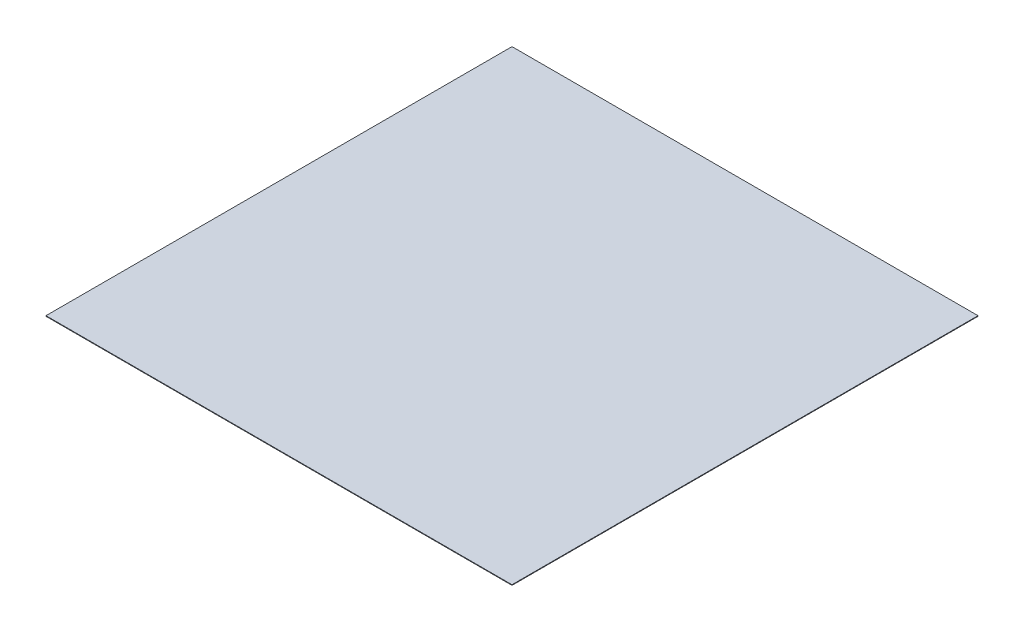
ISO-10303-21;
HEADER;
FILE_DESCRIPTION(('STEP AP214'),'2;1');
FILE_NAME('part.step','',(''),(''),'','','');
FILE_SCHEMA(('AUTOMOTIVE_DESIGN { 1 0 10303 214 1 1 1 1 }'));
ENDSEC;
DATA;
#1=APPLICATION_CONTEXT('core data for automotive mechanical design processes');
#2=APPLICATION_PROTOCOL_DEFINITION('international standard','automotive_design',2000,#1);
#3=PRODUCT_CONTEXT('',#1,'mechanical');
#4=PRODUCT('Part','Part','',(#3));
#5=PRODUCT_RELATED_PRODUCT_CATEGORY('part','',(#4));
#6=PRODUCT_DEFINITION_FORMATION('','',#4);
#7=PRODUCT_DEFINITION_CONTEXT('part definition',#1,'design');
#8=PRODUCT_DEFINITION('design','',#6,#7);
#9=PRODUCT_DEFINITION_SHAPE('','',#8);
#10=(LENGTH_UNIT() NAMED_UNIT(*) SI_UNIT(.MILLI.,.METRE.));
#11=(NAMED_UNIT(*) PLANE_ANGLE_UNIT() SI_UNIT($,.RADIAN.));
#12=(NAMED_UNIT(*) SI_UNIT($,.STERADIAN.) SOLID_ANGLE_UNIT());
#13=UNCERTAINTY_MEASURE_WITH_UNIT(LENGTH_MEASURE(1.E-05),#10,'distance_accuracy_value','');
#14=(GEOMETRIC_REPRESENTATION_CONTEXT(3) GLOBAL_UNCERTAINTY_ASSIGNED_CONTEXT((#13)) GLOBAL_UNIT_ASSIGNED_CONTEXT((#10,
#11,#12)) REPRESENTATION_CONTEXT('',''));
#15=CARTESIAN_POINT('',(0.,0.,0.));
#16=DIRECTION('',(0.,0.,1.));
#17=DIRECTION('',(1.,0.,0.));
#18=AXIS2_PLACEMENT_3D('',#15,#16,#17);
#19=CARTESIAN_POINT('',(0.,25.4,0.));
#20=DIRECTION('',(1.,0.,0.));
#21=DIRECTION('',(0.,0.,-1.));
#22=AXIS2_PLACEMENT_3D('',#19,#20,#21);
#23=PLANE('',#22);
#24=DIRECTION('',(0.,0.,1.));
#25=VECTOR('',#24,1.);
#26=CARTESIAN_POINT('',(0.,0.,0.));
#27=LINE('',#26,#25);
#28=CARTESIAN_POINT('',(0.,0.,-20320.));
#29=VERTEX_POINT('',#28);
#30=CARTESIAN_POINT('',(0.,0.,0.));
#31=VERTEX_POINT('',#30);
#32=EDGE_CURVE('E79',#29,#31,#27,.T.);
#33=ORIENTED_EDGE('',*,*,#32,.T.);
#34=DIRECTION('',(0.,-1.,0.));
#35=VECTOR('',#34,1.);
#36=CARTESIAN_POINT('',(0.,25.4,0.));
#37=LINE('',#36,#35);
#38=CARTESIAN_POINT('',(0.,25.4,0.));
#39=VERTEX_POINT('',#38);
#40=EDGE_CURVE('E11',#39,#31,#37,.T.);
#41=ORIENTED_EDGE('',*,*,#40,.F.);
#42=DIRECTION('',(0.,0.,1.));
#43=VECTOR('',#42,1.);
#44=CARTESIAN_POINT('',(0.,25.4,0.));
#45=LINE('',#44,#43);
#46=CARTESIAN_POINT('',(0.,25.4,-20320.));
#47=VERTEX_POINT('',#46);
#48=EDGE_CURVE('E97',#47,#39,#45,.T.);
#49=ORIENTED_EDGE('',*,*,#48,.F.);
#50=DIRECTION('',(0.,-1.,0.));
#51=VECTOR('',#50,1.);
#52=CARTESIAN_POINT('',(0.,25.4,-20320.));
#53=LINE('',#52,#51);
#54=EDGE_CURVE('E91',#47,#29,#53,.T.);
#55=ORIENTED_EDGE('',*,*,#54,.T.);
#56=EDGE_LOOP('',(#33,#41,#49,#55));
#57=FACE_BOUND('',#56,.T.);
#58=ADVANCED_FACE('F35',(#57),#23,.F.);
#59=CARTESIAN_POINT('',(0.,25.4,0.));
#60=DIRECTION('',(0.,0.,-1.));
#61=DIRECTION('',(-1.,0.,0.));
#62=AXIS2_PLACEMENT_3D('',#59,#60,#61);
#63=PLANE('',#62);
#64=DIRECTION('',(1.,0.,0.));
#65=VECTOR('',#64,1.);
#66=CARTESIAN_POINT('',(0.,0.,0.));
#67=LINE('',#66,#65);
#68=CARTESIAN_POINT('',(20320.,0.,0.));
#69=VERTEX_POINT('',#68);
#70=EDGE_CURVE('E75',#31,#69,#67,.T.);
#71=ORIENTED_EDGE('',*,*,#70,.T.);
#72=DIRECTION('',(0.,-1.,0.));
#73=VECTOR('',#72,1.);
#74=CARTESIAN_POINT('',(20320.,25.4,0.));
#75=LINE('',#74,#73);
#76=CARTESIAN_POINT('',(20320.,25.4,0.));
#77=VERTEX_POINT('',#76);
#78=EDGE_CURVE('E42',#77,#69,#75,.T.);
#79=ORIENTED_EDGE('',*,*,#78,.F.);
#80=DIRECTION('',(1.,0.,0.));
#81=VECTOR('',#80,1.);
#82=CARTESIAN_POINT('',(0.,25.4,0.));
#83=LINE('',#82,#81);
#84=EDGE_CURVE('E87',#39,#77,#83,.T.);
#85=ORIENTED_EDGE('',*,*,#84,.F.);
#86=ORIENTED_EDGE('',*,*,#40,.T.);
#87=EDGE_LOOP('',(#71,#79,#85,#86));
#88=FACE_BOUND('',#87,.T.);
#89=ADVANCED_FACE('F86',(#88),#63,.F.);
#90=CARTESIAN_POINT('',(20320.,25.4,0.));
#91=DIRECTION('',(-1.,0.,0.));
#92=DIRECTION('',(0.,0.,1.));
#93=AXIS2_PLACEMENT_3D('',#90,#91,#92);
#94=PLANE('',#93);
#95=DIRECTION('',(0.,0.,-1.));
#96=VECTOR('',#95,1.);
#97=CARTESIAN_POINT('',(20320.,0.,0.));
#98=LINE('',#97,#96);
#99=CARTESIAN_POINT('',(20320.,0.,-20320.));
#100=VERTEX_POINT('',#99);
#101=EDGE_CURVE('E80',#69,#100,#98,.T.);
#102=ORIENTED_EDGE('',*,*,#101,.T.);
#103=DIRECTION('',(0.,-1.,0.));
#104=VECTOR('',#103,1.);
#105=CARTESIAN_POINT('',(20320.,25.4,-20320.));
#106=LINE('',#105,#104);
#107=CARTESIAN_POINT('',(20320.,25.4,-20320.));
#108=VERTEX_POINT('',#107);
#109=EDGE_CURVE('E103',#108,#100,#106,.T.);
#110=ORIENTED_EDGE('',*,*,#109,.F.);
#111=DIRECTION('',(0.,0.,-1.));
#112=VECTOR('',#111,1.);
#113=CARTESIAN_POINT('',(20320.,25.4,0.));
#114=LINE('',#113,#112);
#115=EDGE_CURVE('E54',#77,#108,#114,.T.);
#116=ORIENTED_EDGE('',*,*,#115,.F.);
#117=ORIENTED_EDGE('',*,*,#78,.T.);
#118=EDGE_LOOP('',(#102,#110,#116,#117));
#119=FACE_BOUND('',#118,.T.);
#120=ADVANCED_FACE('F106',(#119),#94,.F.);
#121=CARTESIAN_POINT('',(0.,25.4,-20320.));
#122=DIRECTION('',(0.,0.,1.));
#123=DIRECTION('',(1.,0.,0.));
#124=AXIS2_PLACEMENT_3D('',#121,#122,#123);
#125=PLANE('',#124);
#126=DIRECTION('',(-1.,0.,0.));
#127=VECTOR('',#126,1.);
#128=CARTESIAN_POINT('',(0.,0.,-20320.));
#129=LINE('',#128,#127);
#130=EDGE_CURVE('E95',#100,#29,#129,.T.);
#131=ORIENTED_EDGE('',*,*,#130,.T.);
#132=ORIENTED_EDGE('',*,*,#54,.F.);
#133=DIRECTION('',(-1.,0.,0.));
#134=VECTOR('',#133,1.);
#135=CARTESIAN_POINT('',(0.,25.4,-20320.));
#136=LINE('',#135,#134);
#137=EDGE_CURVE('E49',#108,#47,#136,.T.);
#138=ORIENTED_EDGE('',*,*,#137,.F.);
#139=ORIENTED_EDGE('',*,*,#109,.T.);
#140=EDGE_LOOP('',(#131,#132,#138,#139));
#141=FACE_BOUND('',#140,.T.);
#142=ADVANCED_FACE('F108',(#141),#125,.F.);
#143=CARTESIAN_POINT('',(0.,25.4,-20320.));
#144=DIRECTION('',(0.,-1.,0.));
#145=DIRECTION('',(0.,0.,-1.));
#146=AXIS2_PLACEMENT_3D('',#143,#144,#145);
#147=PLANE('',#146);
#148=ORIENTED_EDGE('',*,*,#48,.T.);
#149=ORIENTED_EDGE('',*,*,#84,.T.);
#150=ORIENTED_EDGE('',*,*,#115,.T.);
#151=ORIENTED_EDGE('',*,*,#137,.T.);
#152=EDGE_LOOP('',(#148,#149,#150,#151));
#153=FACE_BOUND('',#152,.T.);
#154=ADVANCED_FACE('F109',(#153),#147,.F.);
#155=CARTESIAN_POINT('',(0.,0.,-20320.));
#156=DIRECTION('',(0.,-1.,0.));
#157=DIRECTION('',(0.,0.,-1.));
#158=AXIS2_PLACEMENT_3D('',#155,#156,#157);
#159=PLANE('',#158);
#160=ORIENTED_EDGE('',*,*,#32,.F.);
#161=ORIENTED_EDGE('',*,*,#130,.F.);
#162=ORIENTED_EDGE('',*,*,#101,.F.);
#163=ORIENTED_EDGE('',*,*,#70,.F.);
#164=EDGE_LOOP('',(#160,#161,#162,#163));
#165=FACE_BOUND('',#164,.T.);
#166=ADVANCED_FACE('F76',(#165),#159,.T.);
#167=CLOSED_SHELL('',(#58,#89,#120,#142,#154,#166));
#168=MANIFOLD_SOLID_BREP('B2',#167);
#169=ADVANCED_BREP_SHAPE_REPRESENTATION('',(#18,#168),#14);
#170=SHAPE_DEFINITION_REPRESENTATION(#9,#169);
ENDSEC;
END-ISO-10303-21;
